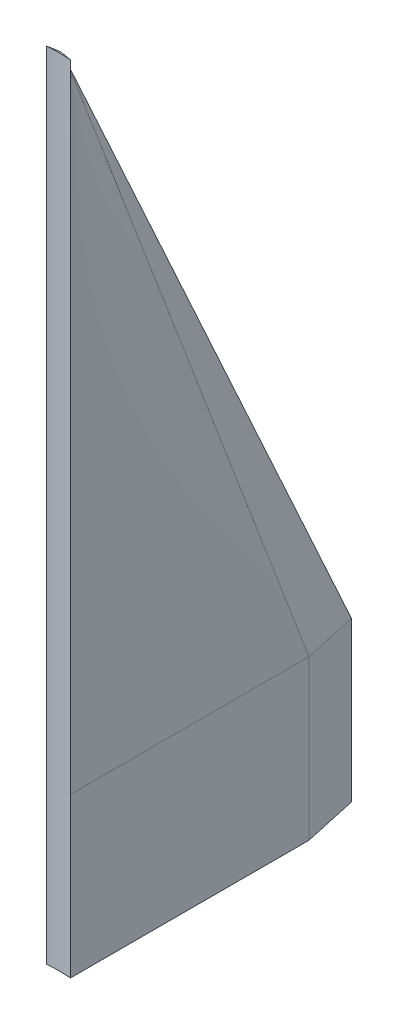
ISO-10303-21;
HEADER;
FILE_DESCRIPTION(('STEP AP214'),'2;1');
FILE_NAME('part.step','',(''),(''),'','','');
FILE_SCHEMA(('AUTOMOTIVE_DESIGN { 1 0 10303 214 1 1 1 1 }'));
ENDSEC;
DATA;
#1=APPLICATION_CONTEXT('core data for automotive mechanical design processes');
#2=APPLICATION_PROTOCOL_DEFINITION('international standard','automotive_design',2000,#1);
#3=PRODUCT_CONTEXT('',#1,'mechanical');
#4=PRODUCT('Part','Part','',(#3));
#5=PRODUCT_RELATED_PRODUCT_CATEGORY('part','',(#4));
#6=PRODUCT_DEFINITION_FORMATION('','',#4);
#7=PRODUCT_DEFINITION_CONTEXT('part definition',#1,'design');
#8=PRODUCT_DEFINITION('design','',#6,#7);
#9=PRODUCT_DEFINITION_SHAPE('','',#8);
#10=(LENGTH_UNIT() NAMED_UNIT(*) SI_UNIT(.MILLI.,.METRE.));
#11=(NAMED_UNIT(*) PLANE_ANGLE_UNIT() SI_UNIT($,.RADIAN.));
#12=(NAMED_UNIT(*) SI_UNIT($,.STERADIAN.) SOLID_ANGLE_UNIT());
#13=UNCERTAINTY_MEASURE_WITH_UNIT(LENGTH_MEASURE(1.E-05),#10,'distance_accuracy_value','');
#14=(GEOMETRIC_REPRESENTATION_CONTEXT(3) GLOBAL_UNCERTAINTY_ASSIGNED_CONTEXT((#13)) GLOBAL_UNIT_ASSIGNED_CONTEXT((#10,
#11,#12)) REPRESENTATION_CONTEXT('',''));
#15=CARTESIAN_POINT('',(0.,0.,0.));
#16=DIRECTION('',(0.,0.,1.));
#17=DIRECTION('',(1.,0.,0.));
#18=AXIS2_PLACEMENT_3D('',#15,#16,#17);
#19=CARTESIAN_POINT('',(1.905,25.4,25.3284617574775));
#20=DIRECTION('',(0.,-1.,0.));
#21=DIRECTION('',(0.,0.,-1.));
#22=AXIS2_PLACEMENT_3D('',#19,#20,#21);
#23=CYLINDRICAL_SURFACE('',#22,25.4);
#24=CARTESIAN_POINT('',(1.905,0.,25.3284617574775));
#25=DIRECTION('',(0.,-1.,0.));
#26=DIRECTION('',(0.,0.,-1.));
#27=AXIS2_PLACEMENT_3D('',#24,#25,#26);
#28=CIRCLE('',#27,25.4);
#29=CARTESIAN_POINT('',(0.,0.,0.));
#30=VERTEX_POINT('',#29);
#31=CARTESIAN_POINT('',(3.81000000000001,0.,0.));
#32=VERTEX_POINT('',#31);
#33=EDGE_CURVE('E212',#30,#32,#28,.T.);
#34=ORIENTED_EDGE('',*,*,#33,.T.);
#35=DIRECTION('',(0.,-1.,0.));
#36=VECTOR('',#35,1.);
#37=CARTESIAN_POINT('',(3.81000000000001,25.4,0.));
#38=LINE('',#37,#36);
#39=CARTESIAN_POINT('',(3.81000000000001,25.4,0.));
#40=VERTEX_POINT('',#39);
#41=EDGE_CURVE('E12',#40,#32,#38,.T.);
#42=ORIENTED_EDGE('',*,*,#41,.F.);
#43=DIRECTION('',(0.,-1.,0.));
#44=VECTOR('',#43,1.);
#45=CARTESIAN_POINT('',(3.81000000000001,76.2,0.));
#46=LINE('',#45,#44);
#47=CARTESIAN_POINT('',(3.81000000000001,127.,0.));
#48=VERTEX_POINT('',#47);
#49=EDGE_CURVE('E136',#48,#40,#46,.T.);
#50=ORIENTED_EDGE('',*,*,#49,.F.);
#51=CARTESIAN_POINT('',(1.905,127.,25.3284617574775));
#52=DIRECTION('',(0.,-1.,0.));
#53=DIRECTION('',(0.,0.,-1.));
#54=AXIS2_PLACEMENT_3D('',#51,#52,#53);
#55=CIRCLE('',#54,25.4);
#56=CARTESIAN_POINT('',(0.,127.,0.));
#57=VERTEX_POINT('',#56);
#58=EDGE_CURVE('E117',#57,#48,#55,.T.);
#59=ORIENTED_EDGE('',*,*,#58,.F.);
#60=DIRECTION('',(0.,1.,0.));
#61=VECTOR('',#60,1.);
#62=CARTESIAN_POINT('',(0.,76.2,0.));
#63=LINE('',#62,#61);
#64=CARTESIAN_POINT('',(0.,25.4,0.));
#65=VERTEX_POINT('',#64);
#66=EDGE_CURVE('E126',#65,#57,#63,.T.);
#67=ORIENTED_EDGE('',*,*,#66,.F.);
#68=DIRECTION('',(0.,-1.,0.));
#69=VECTOR('',#68,1.);
#70=CARTESIAN_POINT('',(0.,25.4,0.));
#71=LINE('',#70,#69);
#72=EDGE_CURVE('E64',#65,#30,#71,.T.);
#73=ORIENTED_EDGE('',*,*,#72,.T.);
#74=EDGE_LOOP('',(#34,#42,#50,#59,#67,#73));
#75=FACE_BOUND('',#74,.T.);
#76=ADVANCED_FACE('F47',(#75),#23,.F.);
#77=CARTESIAN_POINT('',(3.81,25.4,-38.1));
#78=DIRECTION('',(-1.,0.,0.));
#79=DIRECTION('',(0.,0.,1.));
#80=AXIS2_PLACEMENT_3D('',#77,#78,#79);
#81=PLANE('',#80);
#82=DIRECTION('',(0.,0.,-1.));
#83=VECTOR('',#82,1.);
#84=CARTESIAN_POINT('',(3.81,0.,-38.1));
#85=LINE('',#84,#83);
#86=CARTESIAN_POINT('',(3.81,0.,-38.1));
#87=VERTEX_POINT('',#86);
#88=EDGE_CURVE('E205',#32,#87,#85,.T.);
#89=ORIENTED_EDGE('',*,*,#88,.T.);
#90=DIRECTION('',(0.,-1.,0.));
#91=VECTOR('',#90,1.);
#92=CARTESIAN_POINT('',(3.81,25.4,-38.1));
#93=LINE('',#92,#91);
#94=CARTESIAN_POINT('',(3.81,25.4,-38.1));
#95=VERTEX_POINT('',#94);
#96=EDGE_CURVE('E56',#95,#87,#93,.T.);
#97=ORIENTED_EDGE('',*,*,#96,.F.);
#98=DIRECTION('',(0.,0.,1.));
#99=VECTOR('',#98,1.);
#100=CARTESIAN_POINT('',(3.81,25.4,-38.1));
#101=LINE('',#100,#99);
#102=EDGE_CURVE('E227',#40,#95,#101,.F.);
#103=ORIENTED_EDGE('',*,*,#102,.F.);
#104=ORIENTED_EDGE('',*,*,#41,.T.);
#105=EDGE_LOOP('',(#89,#97,#103,#104));
#106=FACE_BOUND('',#105,.T.);
#107=ADVANCED_FACE('F198',(#106),#81,.F.);
#108=CARTESIAN_POINT('',(1.905,25.4,-46.7834944002976));
#109=DIRECTION('',(-0.976771023655524,0.,0.214285714285714));
#110=DIRECTION('',(0.214285714285714,0.,0.976771023655525));
#111=AXIS2_PLACEMENT_3D('',#108,#109,#110);
#112=PLANE('',#111);
#113=DIRECTION('',(-0.214285714285714,0.,-0.976771023655525));
#114=VECTOR('',#113,1.);
#115=CARTESIAN_POINT('',(1.905,0.,-46.7834944002976));
#116=LINE('',#115,#114);
#117=CARTESIAN_POINT('',(1.905,0.,-46.7834944002976));
#118=VERTEX_POINT('',#117);
#119=EDGE_CURVE('E211',#87,#118,#116,.T.);
#120=ORIENTED_EDGE('',*,*,#119,.T.);
#121=DIRECTION('',(0.,-1.,0.));
#122=VECTOR('',#121,1.);
#123=CARTESIAN_POINT('',(1.905,25.4,-46.7834944002976));
#124=LINE('',#123,#122);
#125=CARTESIAN_POINT('',(1.905,25.4,-46.7834944002976));
#126=VERTEX_POINT('',#125);
#127=EDGE_CURVE('E218',#126,#118,#124,.T.);
#128=ORIENTED_EDGE('',*,*,#127,.F.);
#129=DIRECTION('',(0.214285714285714,0.,0.976771023655525));
#130=VECTOR('',#129,1.);
#131=CARTESIAN_POINT('',(1.905,25.4,-46.7834944002976));
#132=LINE('',#131,#130);
#133=EDGE_CURVE('E216',#95,#126,#132,.F.);
#134=ORIENTED_EDGE('',*,*,#133,.F.);
#135=ORIENTED_EDGE('',*,*,#96,.T.);
#136=EDGE_LOOP('',(#120,#128,#134,#135));
#137=FACE_BOUND('',#136,.T.);
#138=ADVANCED_FACE('F196',(#137),#112,.F.);
#139=CARTESIAN_POINT('',(0.,25.4,-38.1));
#140=DIRECTION('',(0.976771023655524,0.,0.214285714285714));
#141=DIRECTION('',(0.214285714285714,0.,-0.976771023655525));
#142=AXIS2_PLACEMENT_3D('',#139,#140,#141);
#143=PLANE('',#142);
#144=DIRECTION('',(-0.214285714285714,0.,0.976771023655525));
#145=VECTOR('',#144,1.);
#146=CARTESIAN_POINT('',(0.,0.,-38.1));
#147=LINE('',#146,#145);
#148=CARTESIAN_POINT('',(0.,0.,-38.1));
#149=VERTEX_POINT('',#148);
#150=EDGE_CURVE('E221',#118,#149,#147,.T.);
#151=ORIENTED_EDGE('',*,*,#150,.T.);
#152=DIRECTION('',(0.,-1.,0.));
#153=VECTOR('',#152,1.);
#154=CARTESIAN_POINT('',(0.,25.4,-38.1));
#155=LINE('',#154,#153);
#156=CARTESIAN_POINT('',(0.,25.4000000000001,-38.0999999999999));
#157=VERTEX_POINT('',#156);
#158=EDGE_CURVE('E72',#157,#149,#155,.T.);
#159=ORIENTED_EDGE('',*,*,#158,.F.);
#160=DIRECTION('',(0.214285714285714,0.,-0.976771023655525));
#161=VECTOR('',#160,1.);
#162=CARTESIAN_POINT('',(0.,25.4,-38.1));
#163=LINE('',#162,#161);
#164=EDGE_CURVE('E232',#126,#157,#163,.F.);
#165=ORIENTED_EDGE('',*,*,#164,.F.);
#166=ORIENTED_EDGE('',*,*,#127,.T.);
#167=EDGE_LOOP('',(#151,#159,#165,#166));
#168=FACE_BOUND('',#167,.T.);
#169=ADVANCED_FACE('F193',(#168),#143,.F.);
#170=CARTESIAN_POINT('',(0.,25.4,0.));
#171=DIRECTION('',(1.,0.,0.));
#172=DIRECTION('',(0.,0.,-1.));
#173=AXIS2_PLACEMENT_3D('',#170,#171,#172);
#174=PLANE('',#173);
#175=DIRECTION('',(0.,0.,1.));
#176=VECTOR('',#175,1.);
#177=CARTESIAN_POINT('',(0.,0.,0.));
#178=LINE('',#177,#176);
#179=EDGE_CURVE('E223',#149,#30,#178,.T.);
#180=ORIENTED_EDGE('',*,*,#179,.T.);
#181=ORIENTED_EDGE('',*,*,#72,.F.);
#182=DIRECTION('',(0.,0.,-1.));
#183=VECTOR('',#182,1.);
#184=CARTESIAN_POINT('',(0.,25.4,0.));
#185=LINE('',#184,#183);
#186=EDGE_CURVE('E51',#157,#65,#185,.F.);
#187=ORIENTED_EDGE('',*,*,#186,.F.);
#188=ORIENTED_EDGE('',*,*,#158,.T.);
#189=EDGE_LOOP('',(#180,#181,#187,#188));
#190=FACE_BOUND('',#189,.T.);
#191=ADVANCED_FACE('F189',(#190),#174,.F.);
#192=CARTESIAN_POINT('',(1.905,0.,25.3284617574775));
#193=DIRECTION('',(0.,-1.,0.));
#194=DIRECTION('',(0.,0.,-1.));
#195=AXIS2_PLACEMENT_3D('',#192,#193,#194);
#196=PLANE('',#195);
#197=ORIENTED_EDGE('',*,*,#33,.F.);
#198=ORIENTED_EDGE('',*,*,#179,.F.);
#199=ORIENTED_EDGE('',*,*,#150,.F.);
#200=ORIENTED_EDGE('',*,*,#119,.F.);
#201=ORIENTED_EDGE('',*,*,#88,.F.);
#202=EDGE_LOOP('',(#197,#198,#199,#200,#201));
#203=FACE_BOUND('',#202,.T.);
#204=ADVANCED_FACE('F181',(#203),#196,.T.);
#205=CARTESIAN_POINT('',(1.905,127.,25.3284617574775));
#206=DIRECTION('',(0.,-1.,0.));
#207=DIRECTION('',(0.,0.,-1.));
#208=AXIS2_PLACEMENT_3D('',#205,#206,#207);
#209=PLANE('',#208);
#210=ORIENTED_EDGE('',*,*,#58,.T.);
#211=DIRECTION('',(-0.985711148204037,0.,-0.16844444872503));
#212=VECTOR('',#211,1.);
#213=CARTESIAN_POINT('',(1.905,127.,-0.325538242522506));
#214=LINE('',#213,#212);
#215=CARTESIAN_POINT('',(2.51113636363637,127.,-0.221957892628981));
#216=VERTEX_POINT('',#215);
#217=EDGE_CURVE('E127',#48,#216,#214,.T.);
#218=ORIENTED_EDGE('',*,*,#217,.T.);
#219=CARTESIAN_POINT('',(2.20806818181819,127.,-0.273748067575743));
#220=VERTEX_POINT('',#219);
#221=EDGE_CURVE('E320',#216,#220,#214,.T.);
#222=ORIENTED_EDGE('',*,*,#221,.T.);
#223=CARTESIAN_POINT('',(1.905,127.,-0.325538242522506));
#224=VERTEX_POINT('',#223);
#225=EDGE_CURVE('E120',#220,#224,#214,.T.);
#226=ORIENTED_EDGE('',*,*,#225,.T.);
#227=DIRECTION('',(-0.985711148204037,0.,0.16844444872503));
#228=VECTOR('',#227,1.);
#229=CARTESIAN_POINT('',(0.,127.,0.));
#230=LINE('',#229,#228);
#231=EDGE_CURVE('E113',#224,#57,#230,.T.);
#232=ORIENTED_EDGE('',*,*,#231,.T.);
#233=EDGE_LOOP('',(#210,#218,#222,#226,#232));
#234=FACE_BOUND('',#233,.T.);
#235=ADVANCED_FACE('F116',(#234),#209,.F.);
#236=CARTESIAN_POINT('',(0.,127.,0.));
#237=CARTESIAN_POINT('',(0.,25.4,0.));
#238=CARTESIAN_POINT('',(0.317499999999999,127.,-0.0542563737537507));
#239=CARTESIAN_POINT('',(0.,25.4,-6.34999999999999));
#240=CARTESIAN_POINT('',(0.634999999999999,127.,-0.108512747507502));
#241=CARTESIAN_POINT('',(0.,25.4,-12.7));
#242=CARTESIAN_POINT('',(1.27,127.,-0.217025495015004));
#243=CARTESIAN_POINT('',(0.,25.4,-25.4));
#244=CARTESIAN_POINT('',(1.5875,127.,-0.271281868768755));
#245=CARTESIAN_POINT('',(0.,25.4,-31.75));
#246=CARTESIAN_POINT('',(1.905,127.,-0.325538242522506));
#247=CARTESIAN_POINT('',(0.,25.4,-38.1));
#248=B_SPLINE_SURFACE_WITH_KNOTS('',3,1,((#236,#237),(#238,#239),(#240,#241),(#242,#243),(#244,
#245),(#246,#247)),.UNSPECIFIED.,.F.,.F.,.F.,(4,2,4),(2,2),(0.,0.5,1.),(0.,1.),.UNSPECIFIED.);
#249=DIRECTION('',(-0.0175719024282385,-0.937168129506049,-0.348435252641269));
#250=VECTOR('',#249,1.);
#251=CARTESIAN_POINT('',(0.952500000000002,76.2,-19.2127691212612));
#252=LINE('',#251,#250);
#253=EDGE_CURVE('E142',#224,#157,#252,.T.);
#254=ORIENTED_EDGE('',*,*,#231,.F.);
#255=ORIENTED_EDGE('',*,*,#253,.T.);
#256=ORIENTED_EDGE('',*,*,#186,.T.);
#257=ORIENTED_EDGE('',*,*,#66,.T.);
#258=EDGE_LOOP('',(#254,#255,#256,#257));
#259=FACE_BOUND('',#258,.T.);
#260=ADVANCED_FACE('F141',(#259),#248,.T.);
#261=CARTESIAN_POINT('',(1.905,127.,-0.325538242522506));
#262=CARTESIAN_POINT('',(0.,25.4,-38.1));
#263=CARTESIAN_POINT('',(1.95551136363637,127.,-0.316906546698045));
#264=CARTESIAN_POINT('',(0.317500000000004,25.4,-39.5472490667163));
#265=CARTESIAN_POINT('',(2.00602272727273,127.,-0.308274850873585));
#266=CARTESIAN_POINT('',(0.635000000000006,25.4,-40.9944981334326));
#267=CARTESIAN_POINT('',(2.10704545454546,127.,-0.291011459224664));
#268=CARTESIAN_POINT('',(1.27000000000001,25.4,-43.8889962668651));
#269=CARTESIAN_POINT('',(2.15755681818182,127.,-0.282379763400204));
#270=CARTESIAN_POINT('',(1.5875,25.4,-45.3362453335814));
#271=CARTESIAN_POINT('',(2.20806818181819,127.,-0.273748067575743));
#272=CARTESIAN_POINT('',(1.905,25.4,-46.7834944002976));
#273=B_SPLINE_SURFACE_WITH_KNOTS('',3,1,((#261,#262),(#263,#264),(#265,#266),(#267,#268),(#269,
#270),(#271,#272)),.UNSPECIFIED.,.F.,.F.,.F.,(4,2,4),(2,2),(0.,0.5,1.),(0.,1.),.UNSPECIFIED.);
#274=DIRECTION('',(-0.00271226432248233,-0.909254325251209,-0.41623216554492));
#275=VECTOR('',#274,1.);
#276=CARTESIAN_POINT('',(2.05653409090909,76.2,-23.5286212339367));
#277=LINE('',#276,#275);
#278=EDGE_CURVE('E144',#220,#126,#277,.T.);
#279=ORIENTED_EDGE('',*,*,#225,.F.);
#280=ORIENTED_EDGE('',*,*,#278,.T.);
#281=ORIENTED_EDGE('',*,*,#164,.T.);
#282=ORIENTED_EDGE('',*,*,#253,.F.);
#283=EDGE_LOOP('',(#279,#280,#281,#282));
#284=FACE_BOUND('',#283,.T.);
#285=ADVANCED_FACE('F240',(#284),#273,.T.);
#286=CARTESIAN_POINT('',(2.20806818181819,127.,-0.273748067575743));
#287=CARTESIAN_POINT('',(1.905,25.4,-46.7834944002976));
#288=CARTESIAN_POINT('',(2.25857954545455,127.,-0.265116371751283));
#289=CARTESIAN_POINT('',(2.22249999999999,25.4,-45.3362453335814));
#290=CARTESIAN_POINT('',(2.30909090909091,127.,-0.256484675926823));
#291=CARTESIAN_POINT('',(2.53999999999999,25.4,-43.8889962668651));
#292=CARTESIAN_POINT('',(2.41011363636364,127.,-0.239221284277902));
#293=CARTESIAN_POINT('',(3.17499999999999,25.4,-40.9944981334326));
#294=CARTESIAN_POINT('',(2.460625,127.,-0.230589588453442));
#295=CARTESIAN_POINT('',(3.49249999999999,25.4,-39.5472490667163));
#296=CARTESIAN_POINT('',(2.51113636363637,127.,-0.221957892628981));
#297=CARTESIAN_POINT('',(3.81,25.4,-38.1));
#298=B_SPLINE_SURFACE_WITH_KNOTS('',3,1,((#286,#287),(#288,#289),(#290,#291),(#292,#293),(#294,
#295),(#296,#297)),.UNSPECIFIED.,.F.,.F.,.F.,(4,2,4),(2,2),(0.,0.5,1.),(0.,1.),.UNSPECIFIED.);
#299=DIRECTION('',(0.0119778395206185,-0.936933224723937,-0.349303111593388));
#300=VECTOR('',#299,1.);
#301=CARTESIAN_POINT('',(3.16056818181818,76.2,-19.1609789463145));
#302=LINE('',#301,#300);
#303=EDGE_CURVE('E162',#216,#95,#302,.T.);
#304=ORIENTED_EDGE('',*,*,#221,.F.);
#305=ORIENTED_EDGE('',*,*,#303,.T.);
#306=ORIENTED_EDGE('',*,*,#133,.T.);
#307=ORIENTED_EDGE('',*,*,#278,.F.);
#308=EDGE_LOOP('',(#304,#305,#306,#307));
#309=FACE_BOUND('',#308,.T.);
#310=ADVANCED_FACE('F176',(#309),#298,.T.);
#311=CARTESIAN_POINT('',(2.51113636363637,127.,-0.221957892628981));
#312=CARTESIAN_POINT('',(3.81,25.4,-38.1));
#313=CARTESIAN_POINT('',(2.72761363636364,127.,-0.184964910524151));
#314=CARTESIAN_POINT('',(3.81,25.4,-31.75));
#315=CARTESIAN_POINT('',(2.94409090909091,127.,-0.147971928419321));
#316=CARTESIAN_POINT('',(3.81,25.4,-25.4));
#317=CARTESIAN_POINT('',(3.37704545454546,127.,-0.0739859642096609));
#318=CARTESIAN_POINT('',(3.81,25.4,-12.7));
#319=CARTESIAN_POINT('',(3.59352272727273,127.,-0.0369929821048305));
#320=CARTESIAN_POINT('',(3.81,25.4,-6.35000000000001));
#321=CARTESIAN_POINT('',(3.81000000000001,127.,0.));
#322=CARTESIAN_POINT('',(3.81000000000001,25.4,0.));
#323=B_SPLINE_SURFACE_WITH_KNOTS('',3,1,((#311,#312),(#313,#314),(#315,#316),(#317,#318),(#319,
#320),(#321,#322)),.UNSPECIFIED.,.F.,.F.,.F.,(4,2,4),(2,2),(0.,0.5,1.),(0.,1.),.UNSPECIFIED.);
#324=ORIENTED_EDGE('',*,*,#217,.F.);
#325=ORIENTED_EDGE('',*,*,#49,.T.);
#326=ORIENTED_EDGE('',*,*,#102,.T.);
#327=ORIENTED_EDGE('',*,*,#303,.F.);
#328=EDGE_LOOP('',(#324,#325,#326,#327));
#329=FACE_BOUND('',#328,.T.);
#330=ADVANCED_FACE('F164',(#329),#323,.T.);
#331=CLOSED_SHELL('',(#76,#107,#138,#169,#191,#204,#235,#260,#285,#310,#330));
#332=MANIFOLD_SOLID_BREP('B2',#331);
#333=ADVANCED_BREP_SHAPE_REPRESENTATION('',(#18,#332),#14);
#334=SHAPE_DEFINITION_REPRESENTATION(#9,#333);
ENDSEC;
END-ISO-10303-21;
